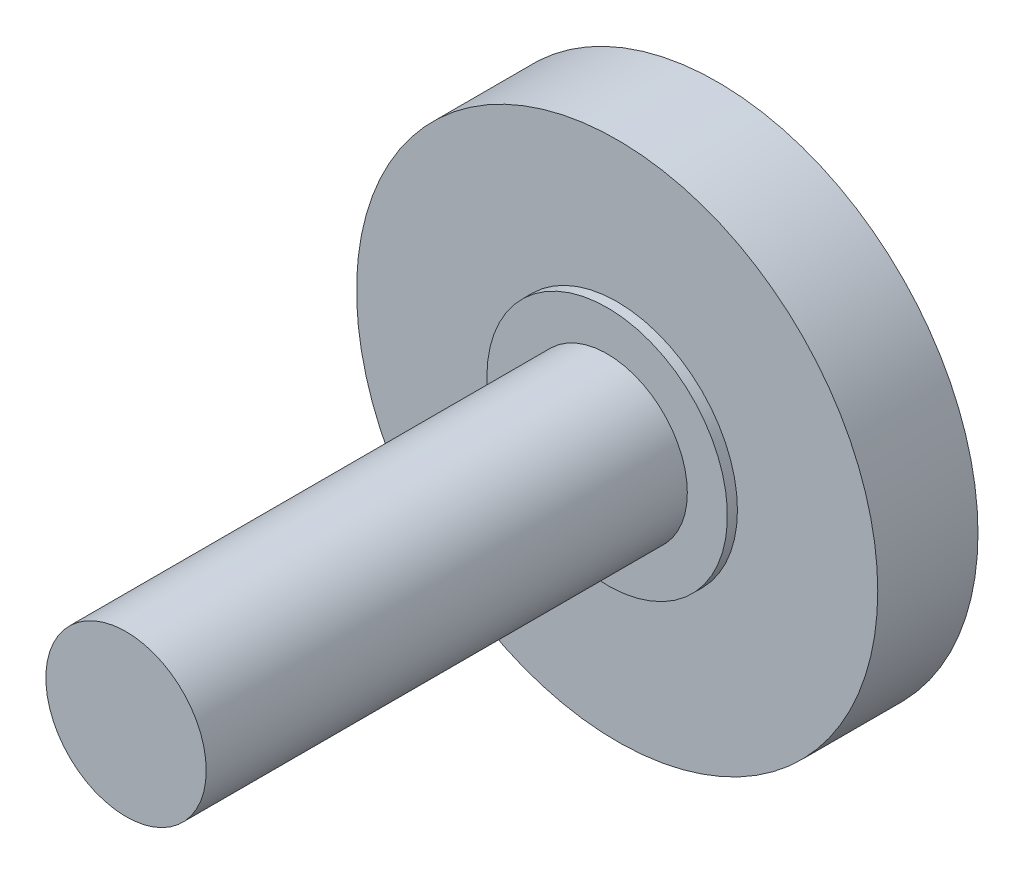
ISO-10303-21;
HEADER;
FILE_DESCRIPTION(('STEP AP214'),'2;1');
FILE_NAME('part.step','',(''),(''),'','','');
FILE_SCHEMA(('AUTOMOTIVE_DESIGN { 1 0 10303 214 1 1 1 1 }'));
ENDSEC;
DATA;
#1=APPLICATION_CONTEXT('core data for automotive mechanical design processes');
#2=APPLICATION_PROTOCOL_DEFINITION('international standard','automotive_design',2000,#1);
#3=PRODUCT_CONTEXT('',#1,'mechanical');
#4=PRODUCT('Part','Part','',(#3));
#5=PRODUCT_RELATED_PRODUCT_CATEGORY('part','',(#4));
#6=PRODUCT_DEFINITION_FORMATION('','',#4);
#7=PRODUCT_DEFINITION_CONTEXT('part definition',#1,'design');
#8=PRODUCT_DEFINITION('design','',#6,#7);
#9=PRODUCT_DEFINITION_SHAPE('','',#8);
#10=(LENGTH_UNIT() NAMED_UNIT(*) SI_UNIT(.MILLI.,.METRE.));
#11=(NAMED_UNIT(*) PLANE_ANGLE_UNIT() SI_UNIT($,.RADIAN.));
#12=(NAMED_UNIT(*) SI_UNIT($,.STERADIAN.) SOLID_ANGLE_UNIT());
#13=UNCERTAINTY_MEASURE_WITH_UNIT(LENGTH_MEASURE(1.E-05),#10,'distance_accuracy_value','');
#14=(GEOMETRIC_REPRESENTATION_CONTEXT(3) GLOBAL_UNCERTAINTY_ASSIGNED_CONTEXT((#13)) GLOBAL_UNIT_ASSIGNED_CONTEXT((#10,
#11,#12)) REPRESENTATION_CONTEXT('',''));
#15=CARTESIAN_POINT('',(0.,0.,0.));
#16=DIRECTION('',(0.,0.,1.));
#17=DIRECTION('',(1.,0.,0.));
#18=AXIS2_PLACEMENT_3D('',#15,#16,#17);
#19=CARTESIAN_POINT('',(0.,0.,5.));
#20=DIRECTION('',(0.,0.,-1.));
#21=DIRECTION('',(-1.,0.,0.));
#22=AXIS2_PLACEMENT_3D('',#19,#20,#21);
#23=CYLINDRICAL_SURFACE('',#22,13.);
#24=CARTESIAN_POINT('',(0.,0.,5.));
#25=DIRECTION('',(0.,0.,1.));
#26=DIRECTION('',(1.,0.,0.));
#27=AXIS2_PLACEMENT_3D('',#24,#25,#26);
#28=CIRCLE('',#27,13.);
#29=CARTESIAN_POINT('',(13.,0.,5.));
#30=VERTEX_POINT('',#29);
#31=EDGE_CURVE('E155',#30,#30,#28,.T.);
#32=ORIENTED_EDGE('',*,*,#31,.F.);
#33=EDGE_LOOP('',(#32));
#34=FACE_BOUND('',#33,.T.);
#35=CARTESIAN_POINT('',(0.,0.,0.));
#36=DIRECTION('',(0.,0.,1.));
#37=DIRECTION('',(1.,0.,0.));
#38=AXIS2_PLACEMENT_3D('',#35,#36,#37);
#39=CIRCLE('',#38,13.);
#40=CARTESIAN_POINT('',(13.,0.,0.));
#41=VERTEX_POINT('',#40);
#42=EDGE_CURVE('E154',#41,#41,#39,.T.);
#43=ORIENTED_EDGE('',*,*,#42,.T.);
#44=EDGE_LOOP('',(#43));
#45=FACE_BOUND('',#44,.T.);
#46=ADVANCED_FACE('F43',(#34,#45),#23,.T.);
#47=CARTESIAN_POINT('',(0.,0.,5.));
#48=DIRECTION('',(0.,0.,1.));
#49=DIRECTION('',(1.,0.,0.));
#50=AXIS2_PLACEMENT_3D('',#47,#48,#49);
#51=PLANE('',#50);
#52=CARTESIAN_POINT('',(0.,0.,5.));
#53=DIRECTION('',(0.,0.,1.));
#54=DIRECTION('',(1.,0.,0.));
#55=AXIS2_PLACEMENT_3D('',#52,#53,#54);
#56=CIRCLE('',#55,6.);
#57=CARTESIAN_POINT('',(6.,0.,5.));
#58=VERTEX_POINT('',#57);
#59=EDGE_CURVE('E11',#58,#58,#56,.T.);
#60=ORIENTED_EDGE('',*,*,#59,.F.);
#61=EDGE_LOOP('',(#60));
#62=FACE_BOUND('',#61,.T.);
#63=ORIENTED_EDGE('',*,*,#31,.T.);
#64=EDGE_LOOP('',(#63));
#65=FACE_BOUND('',#64,.T.);
#66=ADVANCED_FACE('F167',(#62,#65),#51,.T.);
#67=CARTESIAN_POINT('',(0.,0.,0.));
#68=DIRECTION('',(0.,0.,1.));
#69=DIRECTION('',(1.,0.,0.));
#70=AXIS2_PLACEMENT_3D('',#67,#68,#69);
#71=PLANE('',#70);
#72=CARTESIAN_POINT('',(0.,0.,0.));
#73=DIRECTION('',(0.,0.,1.));
#74=DIRECTION('',(1.,0.,0.));
#75=AXIS2_PLACEMENT_3D('',#72,#73,#74);
#76=CIRCLE('',#75,6.);
#77=CARTESIAN_POINT('',(6.,0.,0.));
#78=VERTEX_POINT('',#77);
#79=EDGE_CURVE('E51',#78,#78,#76,.F.);
#80=ORIENTED_EDGE('',*,*,#79,.F.);
#81=EDGE_LOOP('',(#80));
#82=FACE_BOUND('',#81,.T.);
#83=ORIENTED_EDGE('',*,*,#42,.F.);
#84=EDGE_LOOP('',(#83));
#85=FACE_BOUND('',#84,.T.);
#86=ADVANCED_FACE('F164',(#82,#85),#71,.F.);
#87=CARTESIAN_POINT('',(0.,0.,-0.5));
#88=DIRECTION('',(0.,0.,1.));
#89=DIRECTION('',(1.,0.,0.));
#90=AXIS2_PLACEMENT_3D('',#87,#88,#89);
#91=CYLINDRICAL_SURFACE('',#90,6.);
#92=CARTESIAN_POINT('',(0.,0.,-0.5));
#93=DIRECTION('',(0.,0.,-1.));
#94=DIRECTION('',(-1.,0.,0.));
#95=AXIS2_PLACEMENT_3D('',#92,#93,#94);
#96=CIRCLE('',#95,6.);
#97=CARTESIAN_POINT('',(-6.,0.,-0.5));
#98=VERTEX_POINT('',#97);
#99=EDGE_CURVE('E151',#98,#98,#96,.T.);
#100=ORIENTED_EDGE('',*,*,#99,.F.);
#101=EDGE_LOOP('',(#100));
#102=FACE_BOUND('',#101,.T.);
#103=ORIENTED_EDGE('',*,*,#79,.T.);
#104=EDGE_LOOP('',(#103));
#105=FACE_BOUND('',#104,.T.);
#106=ADVANCED_FACE('F162',(#102,#105),#91,.T.);
#107=CARTESIAN_POINT('',(0.,0.,5.5));
#108=DIRECTION('',(0.,0.,-1.));
#109=DIRECTION('',(-1.,0.,0.));
#110=AXIS2_PLACEMENT_3D('',#107,#108,#109);
#111=CYLINDRICAL_SURFACE('',#110,6.);
#112=CARTESIAN_POINT('',(0.,0.,5.5));
#113=DIRECTION('',(0.,0.,-1.));
#114=DIRECTION('',(-1.,0.,0.));
#115=AXIS2_PLACEMENT_3D('',#112,#113,#114);
#116=CIRCLE('',#115,6.);
#117=CARTESIAN_POINT('',(-6.,0.,5.5));
#118=VERTEX_POINT('',#117);
#119=EDGE_CURVE('E148',#118,#118,#116,.T.);
#120=ORIENTED_EDGE('',*,*,#119,.T.);
#121=EDGE_LOOP('',(#120));
#122=FACE_BOUND('',#121,.T.);
#123=ORIENTED_EDGE('',*,*,#59,.T.);
#124=EDGE_LOOP('',(#123));
#125=FACE_BOUND('',#124,.T.);
#126=ADVANCED_FACE('F185',(#122,#125),#111,.T.);
#127=CARTESIAN_POINT('',(0.,0.,5.5));
#128=DIRECTION('',(0.,0.,1.));
#129=DIRECTION('',(-1.,0.,0.));
#130=AXIS2_PLACEMENT_3D('',#127,#128,#129);
#131=PLANE('',#130);
#132=CARTESIAN_POINT('',(0.,0.,5.5));
#133=DIRECTION('',(0.,0.,1.));
#134=DIRECTION('',(1.,0.,0.));
#135=AXIS2_PLACEMENT_3D('',#132,#133,#134);
#136=CIRCLE('',#135,4.);
#137=CARTESIAN_POINT('',(4.,0.,5.5));
#138=VERTEX_POINT('',#137);
#139=EDGE_CURVE('E132',#138,#138,#136,.F.);
#140=ORIENTED_EDGE('',*,*,#139,.T.);
#141=EDGE_LOOP('',(#140));
#142=FACE_BOUND('',#141,.T.);
#143=ORIENTED_EDGE('',*,*,#119,.F.);
#144=EDGE_LOOP('',(#143));
#145=FACE_BOUND('',#144,.T.);
#146=ADVANCED_FACE('F189',(#142,#145),#131,.T.);
#147=CARTESIAN_POINT('',(0.,0.,-0.5));
#148=DIRECTION('',(0.,0.,-1.));
#149=DIRECTION('',(-1.,0.,0.));
#150=AXIS2_PLACEMENT_3D('',#147,#148,#149);
#151=PLANE('',#150);
#152=ORIENTED_EDGE('',*,*,#99,.T.);
#153=EDGE_LOOP('',(#152));
#154=FACE_BOUND('',#153,.T.);
#155=DIRECTION('',(0.0954979079820121,0.995429630647521,0.));
#156=VECTOR('',#155,1.);
#157=CARTESIAN_POINT('',(-6.41742950268511,-2.92729985158434,-0.5));
#158=LINE('',#157,#156);
#159=CARTESIAN_POINT('',(-6.41742950268511,-2.92729985158434,-0.5));
#160=VERTEX_POINT('',#159);
#161=CARTESIAN_POINT('',(-5.74383078730901,4.09400705052887,-0.5));
#162=VERTEX_POINT('',#161);
#163=EDGE_CURVE('E128',#160,#162,#158,.T.);
#164=ORIENTED_EDGE('',*,*,#163,.F.);
#165=DIRECTION('',(-0.814318393829508,0.580418429644451,0.));
#166=VECTOR('',#165,1.);
#167=CARTESIAN_POINT('',(-0.673598715376095,-7.0213069021132,-0.5));
#168=LINE('',#167,#166);
#169=CARTESIAN_POINT('',(-0.673598715376095,-7.0213069021132,-0.5));
#170=VERTEX_POINT('',#169);
#171=EDGE_CURVE('E88',#170,#160,#168,.T.);
#172=ORIENTED_EDGE('',*,*,#171,.F.);
#173=DIRECTION('',(-0.90981630181152,-0.415011201003069,0.));
#174=VECTOR('',#173,1.);
#175=CARTESIAN_POINT('',(5.743830787309,-4.09400705052887,-0.5));
#176=LINE('',#175,#174);
#177=CARTESIAN_POINT('',(5.743830787309,-4.09400705052887,-0.5));
#178=VERTEX_POINT('',#177);
#179=EDGE_CURVE('E82',#178,#170,#176,.T.);
#180=ORIENTED_EDGE('',*,*,#179,.F.);
#181=DIRECTION('',(-0.0954979079820124,-0.995429630647521,0.));
#182=VECTOR('',#181,1.);
#183=CARTESIAN_POINT('',(6.4174295026851,2.92729985158434,-0.5));
#184=LINE('',#183,#182);
#185=CARTESIAN_POINT('',(6.4174295026851,2.92729985158434,-0.5));
#186=VERTEX_POINT('',#185);
#187=EDGE_CURVE('E118',#186,#178,#184,.T.);
#188=ORIENTED_EDGE('',*,*,#187,.F.);
#189=DIRECTION('',(0.814318393829507,-0.580418429644452,0.));
#190=VECTOR('',#189,1.);
#191=CARTESIAN_POINT('',(0.673598715376096,7.02130690211321,-0.5));
#192=LINE('',#191,#190);
#193=CARTESIAN_POINT('',(0.673598715376096,7.02130690211321,-0.5));
#194=VERTEX_POINT('',#193);
#195=EDGE_CURVE('E134',#194,#186,#192,.T.);
#196=ORIENTED_EDGE('',*,*,#195,.F.);
#197=DIRECTION('',(0.90981630181152,0.415011201003069,0.));
#198=VECTOR('',#197,1.);
#199=CARTESIAN_POINT('',(-5.74383078730901,4.09400705052887,-0.5));
#200=LINE('',#199,#198);
#201=EDGE_CURVE('E131',#162,#194,#200,.T.);
#202=ORIENTED_EDGE('',*,*,#201,.F.);
#203=EDGE_LOOP('',(#164,#172,#180,#188,#196,#202));
#204=FACE_BOUND('',#203,.T.);
#205=ADVANCED_FACE('F193',(#154,#204),#151,.F.);
#206=CARTESIAN_POINT('',(0.,0.,-3.5));
#207=DIRECTION('',(0.,0.,-1.));
#208=DIRECTION('',(-1.,0.,0.));
#209=AXIS2_PLACEMENT_3D('',#206,#207,#208);
#210=PLANE('',#209);
#211=DIRECTION('',(0.0954979079820121,0.995429630647521,0.));
#212=VECTOR('',#211,1.);
#213=CARTESIAN_POINT('',(-6.41742950268511,-2.92729985158434,-3.5));
#214=LINE('',#213,#212);
#215=CARTESIAN_POINT('',(-6.41742950268511,-2.92729985158434,-3.5));
#216=VERTEX_POINT('',#215);
#217=CARTESIAN_POINT('',(-5.74383078730901,4.09400705052887,-3.5));
#218=VERTEX_POINT('',#217);
#219=EDGE_CURVE('E139',#216,#218,#214,.T.);
#220=ORIENTED_EDGE('',*,*,#219,.T.);
#221=DIRECTION('',(0.90981630181152,0.415011201003069,0.));
#222=VECTOR('',#221,1.);
#223=CARTESIAN_POINT('',(-5.74383078730901,4.09400705052887,-3.5));
#224=LINE('',#223,#222);
#225=CARTESIAN_POINT('',(0.673598715376096,7.02130690211321,-3.5));
#226=VERTEX_POINT('',#225);
#227=EDGE_CURVE('E97',#218,#226,#224,.T.);
#228=ORIENTED_EDGE('',*,*,#227,.T.);
#229=DIRECTION('',(0.814318393829507,-0.580418429644452,0.));
#230=VECTOR('',#229,1.);
#231=CARTESIAN_POINT('',(0.673598715376096,7.02130690211321,-3.5));
#232=LINE('',#231,#230);
#233=CARTESIAN_POINT('',(6.4174295026851,2.92729985158434,-3.5));
#234=VERTEX_POINT('',#233);
#235=EDGE_CURVE('E110',#226,#234,#232,.T.);
#236=ORIENTED_EDGE('',*,*,#235,.T.);
#237=DIRECTION('',(-0.0954979079820124,-0.995429630647521,0.));
#238=VECTOR('',#237,1.);
#239=CARTESIAN_POINT('',(6.4174295026851,2.92729985158434,-3.5));
#240=LINE('',#239,#238);
#241=CARTESIAN_POINT('',(5.743830787309,-4.09400705052887,-3.5));
#242=VERTEX_POINT('',#241);
#243=EDGE_CURVE('E104',#234,#242,#240,.T.);
#244=ORIENTED_EDGE('',*,*,#243,.T.);
#245=DIRECTION('',(-0.90981630181152,-0.415011201003069,0.));
#246=VECTOR('',#245,1.);
#247=CARTESIAN_POINT('',(5.743830787309,-4.09400705052887,-3.5));
#248=LINE('',#247,#246);
#249=CARTESIAN_POINT('',(-0.673598715376095,-7.0213069021132,-3.5));
#250=VERTEX_POINT('',#249);
#251=EDGE_CURVE('E108',#242,#250,#248,.T.);
#252=ORIENTED_EDGE('',*,*,#251,.T.);
#253=DIRECTION('',(-0.814318393829508,0.580418429644451,0.));
#254=VECTOR('',#253,1.);
#255=CARTESIAN_POINT('',(-0.673598715376095,-7.0213069021132,-3.5));
#256=LINE('',#255,#254);
#257=EDGE_CURVE('E59',#250,#216,#256,.T.);
#258=ORIENTED_EDGE('',*,*,#257,.T.);
#259=EDGE_LOOP('',(#220,#228,#236,#244,#252,#258));
#260=FACE_BOUND('',#259,.T.);
#261=ADVANCED_FACE('F106',(#260),#210,.T.);
#262=CARTESIAN_POINT('',(-0.673598715376095,-7.0213069021132,-3.5));
#263=DIRECTION('',(0.580418429644451,0.814318393829508,0.));
#264=DIRECTION('',(-0.814318393829508,0.580418429644451,0.));
#265=AXIS2_PLACEMENT_3D('',#262,#263,#264);
#266=PLANE('',#265);
#267=ORIENTED_EDGE('',*,*,#171,.T.);
#268=DIRECTION('',(0.,0.,1.));
#269=VECTOR('',#268,1.);
#270=CARTESIAN_POINT('',(-6.41742950268511,-2.92729985158434,-3.5));
#271=LINE('',#270,#269);
#272=EDGE_CURVE('E124',#216,#160,#271,.T.);
#273=ORIENTED_EDGE('',*,*,#272,.F.);
#274=ORIENTED_EDGE('',*,*,#257,.F.);
#275=DIRECTION('',(0.,0.,1.));
#276=VECTOR('',#275,1.);
#277=CARTESIAN_POINT('',(-0.673598715376095,-7.0213069021132,-3.5));
#278=LINE('',#277,#276);
#279=EDGE_CURVE('E120',#250,#170,#278,.T.);
#280=ORIENTED_EDGE('',*,*,#279,.T.);
#281=EDGE_LOOP('',(#267,#273,#274,#280));
#282=FACE_BOUND('',#281,.T.);
#283=ADVANCED_FACE('F211',(#282),#266,.F.);
#284=CARTESIAN_POINT('',(5.743830787309,-4.09400705052887,-3.5));
#285=DIRECTION('',(-0.415011201003069,0.90981630181152,0.));
#286=DIRECTION('',(-0.90981630181152,-0.415011201003069,0.));
#287=AXIS2_PLACEMENT_3D('',#284,#285,#286);
#288=PLANE('',#287);
#289=ORIENTED_EDGE('',*,*,#179,.T.);
#290=ORIENTED_EDGE('',*,*,#279,.F.);
#291=ORIENTED_EDGE('',*,*,#251,.F.);
#292=DIRECTION('',(0.,0.,1.));
#293=VECTOR('',#292,1.);
#294=CARTESIAN_POINT('',(5.743830787309,-4.09400705052887,-3.5));
#295=LINE('',#294,#293);
#296=EDGE_CURVE('E115',#242,#178,#295,.T.);
#297=ORIENTED_EDGE('',*,*,#296,.T.);
#298=EDGE_LOOP('',(#289,#290,#291,#297));
#299=FACE_BOUND('',#298,.T.);
#300=ADVANCED_FACE('F122',(#299),#288,.F.);
#301=CARTESIAN_POINT('',(6.4174295026851,2.92729985158434,-3.5));
#302=DIRECTION('',(-0.99542963064752,0.0954979079820123,0.));
#303=DIRECTION('',(-0.0954979079820124,-0.995429630647521,0.));
#304=AXIS2_PLACEMENT_3D('',#301,#302,#303);
#305=PLANE('',#304);
#306=ORIENTED_EDGE('',*,*,#187,.T.);
#307=ORIENTED_EDGE('',*,*,#296,.F.);
#308=ORIENTED_EDGE('',*,*,#243,.F.);
#309=DIRECTION('',(0.,0.,1.));
#310=VECTOR('',#309,1.);
#311=CARTESIAN_POINT('',(6.4174295026851,2.92729985158434,-3.5));
#312=LINE('',#311,#310);
#313=EDGE_CURVE('E119',#234,#186,#312,.T.);
#314=ORIENTED_EDGE('',*,*,#313,.T.);
#315=EDGE_LOOP('',(#306,#307,#308,#314));
#316=FACE_BOUND('',#315,.T.);
#317=ADVANCED_FACE('F116',(#316),#305,.F.);
#318=CARTESIAN_POINT('',(0.673598715376096,7.02130690211321,-3.5));
#319=DIRECTION('',(-0.580418429644452,-0.814318393829507,0.));
#320=DIRECTION('',(0.814318393829507,-0.580418429644452,0.));
#321=AXIS2_PLACEMENT_3D('',#318,#319,#320);
#322=PLANE('',#321);
#323=ORIENTED_EDGE('',*,*,#195,.T.);
#324=ORIENTED_EDGE('',*,*,#313,.F.);
#325=ORIENTED_EDGE('',*,*,#235,.F.);
#326=DIRECTION('',(0.,0.,1.));
#327=VECTOR('',#326,1.);
#328=CARTESIAN_POINT('',(0.673598715376096,7.02130690211321,-3.5));
#329=LINE('',#328,#327);
#330=EDGE_CURVE('E143',#226,#194,#329,.T.);
#331=ORIENTED_EDGE('',*,*,#330,.T.);
#332=EDGE_LOOP('',(#323,#324,#325,#331));
#333=FACE_BOUND('',#332,.T.);
#334=ADVANCED_FACE('F203',(#333),#322,.F.);
#335=CARTESIAN_POINT('',(-5.74383078730901,4.09400705052887,-3.5));
#336=DIRECTION('',(0.415011201003069,-0.90981630181152,0.));
#337=DIRECTION('',(0.90981630181152,0.415011201003069,0.));
#338=AXIS2_PLACEMENT_3D('',#335,#336,#337);
#339=PLANE('',#338);
#340=ORIENTED_EDGE('',*,*,#201,.T.);
#341=ORIENTED_EDGE('',*,*,#330,.F.);
#342=ORIENTED_EDGE('',*,*,#227,.F.);
#343=DIRECTION('',(0.,0.,1.));
#344=VECTOR('',#343,1.);
#345=CARTESIAN_POINT('',(-5.74383078730901,4.09400705052887,-3.5));
#346=LINE('',#345,#344);
#347=EDGE_CURVE('E146',#218,#162,#346,.T.);
#348=ORIENTED_EDGE('',*,*,#347,.T.);
#349=EDGE_LOOP('',(#340,#341,#342,#348));
#350=FACE_BOUND('',#349,.T.);
#351=ADVANCED_FACE('F199',(#350),#339,.F.);
#352=CARTESIAN_POINT('',(-6.41742950268511,-2.92729985158434,-3.5));
#353=DIRECTION('',(0.99542963064752,-0.0954979079820121,0.));
#354=DIRECTION('',(0.0954979079820122,0.995429630647521,0.));
#355=AXIS2_PLACEMENT_3D('',#352,#353,#354);
#356=PLANE('',#355);
#357=ORIENTED_EDGE('',*,*,#163,.T.);
#358=ORIENTED_EDGE('',*,*,#347,.F.);
#359=ORIENTED_EDGE('',*,*,#219,.F.);
#360=ORIENTED_EDGE('',*,*,#272,.T.);
#361=EDGE_LOOP('',(#357,#358,#359,#360));
#362=FACE_BOUND('',#361,.T.);
#363=ADVANCED_FACE('F195',(#362),#356,.F.);
#364=CARTESIAN_POINT('',(0.,0.,29.5));
#365=DIRECTION('',(0.,0.,-1.));
#366=DIRECTION('',(-1.,0.,0.));
#367=AXIS2_PLACEMENT_3D('',#364,#365,#366);
#368=CYLINDRICAL_SURFACE('',#367,4.);
#369=ORIENTED_EDGE('',*,*,#139,.F.);
#370=EDGE_LOOP('',(#369));
#371=FACE_BOUND('',#370,.T.);
#372=CARTESIAN_POINT('',(0.,0.,29.5));
#373=DIRECTION('',(0.,0.,1.));
#374=DIRECTION('',(1.,0.,0.));
#375=AXIS2_PLACEMENT_3D('',#372,#373,#374);
#376=CIRCLE('',#375,4.);
#377=CARTESIAN_POINT('',(4.,0.,29.5));
#378=VERTEX_POINT('',#377);
#379=EDGE_CURVE('E229',#378,#378,#376,.T.);
#380=ORIENTED_EDGE('',*,*,#379,.F.);
#381=EDGE_LOOP('',(#380));
#382=FACE_BOUND('',#381,.T.);
#383=ADVANCED_FACE('F198',(#371,#382),#368,.T.);
#384=CARTESIAN_POINT('',(0.,0.,29.5));
#385=DIRECTION('',(0.,0.,1.));
#386=DIRECTION('',(1.,0.,0.));
#387=AXIS2_PLACEMENT_3D('',#384,#385,#386);
#388=PLANE('',#387);
#389=ORIENTED_EDGE('',*,*,#379,.T.);
#390=EDGE_LOOP('',(#389));
#391=FACE_BOUND('',#390,.T.);
#392=ADVANCED_FACE('F221',(#391),#388,.T.);
#393=CLOSED_SHELL('',(#46,#66,#86,#106,#126,#146,#205,#261,#283,#300,#317,#334,#351,#363,#383,#392));
#394=MANIFOLD_SOLID_BREP('B2',#393);
#395=ADVANCED_BREP_SHAPE_REPRESENTATION('',(#18,#394),#14);
#396=SHAPE_DEFINITION_REPRESENTATION(#9,#395);
ENDSEC;
END-ISO-10303-21;
